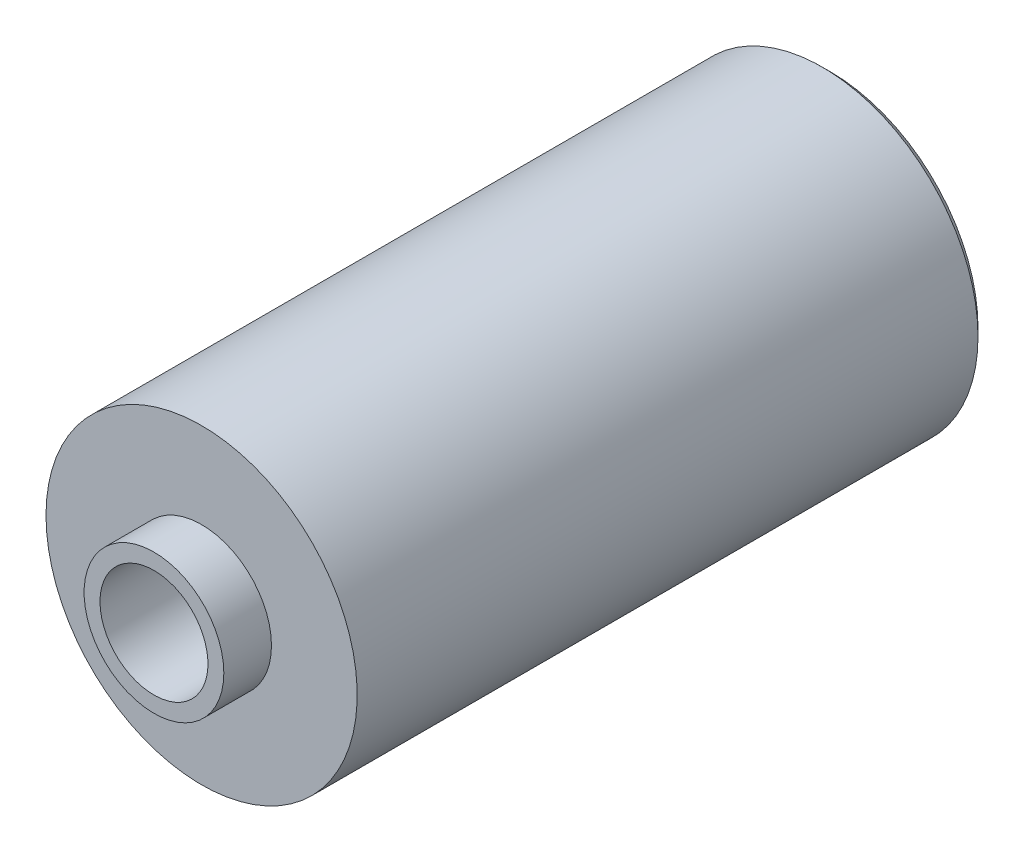
ISO-10303-21;
HEADER;
FILE_DESCRIPTION(('STEP AP214'),'2;1');
FILE_NAME('part.step','',(''),(''),'','','');
FILE_SCHEMA(('AUTOMOTIVE_DESIGN { 1 0 10303 214 1 1 1 1 }'));
ENDSEC;
DATA;
#1=APPLICATION_CONTEXT('core data for automotive mechanical design processes');
#2=APPLICATION_PROTOCOL_DEFINITION('international standard','automotive_design',2000,#1);
#3=PRODUCT_CONTEXT('',#1,'mechanical');
#4=PRODUCT('Part','Part','',(#3));
#5=PRODUCT_RELATED_PRODUCT_CATEGORY('part','',(#4));
#6=PRODUCT_DEFINITION_FORMATION('','',#4);
#7=PRODUCT_DEFINITION_CONTEXT('part definition',#1,'design');
#8=PRODUCT_DEFINITION('design','',#6,#7);
#9=PRODUCT_DEFINITION_SHAPE('','',#8);
#10=(LENGTH_UNIT() NAMED_UNIT(*) SI_UNIT(.MILLI.,.METRE.));
#11=(NAMED_UNIT(*) PLANE_ANGLE_UNIT() SI_UNIT($,.RADIAN.));
#12=(NAMED_UNIT(*) SI_UNIT($,.STERADIAN.) SOLID_ANGLE_UNIT());
#13=UNCERTAINTY_MEASURE_WITH_UNIT(LENGTH_MEASURE(1.E-05),#10,'distance_accuracy_value','');
#14=(GEOMETRIC_REPRESENTATION_CONTEXT(3) GLOBAL_UNCERTAINTY_ASSIGNED_CONTEXT((#13)) GLOBAL_UNIT_ASSIGNED_CONTEXT((#10,
#11,#12)) REPRESENTATION_CONTEXT('',''));
#15=CARTESIAN_POINT('',(0.,0.,0.));
#16=DIRECTION('',(0.,0.,1.));
#17=DIRECTION('',(1.,0.,0.));
#18=AXIS2_PLACEMENT_3D('',#15,#16,#17);
#19=CARTESIAN_POINT('',(0.,0.,19.8));
#20=DIRECTION('',(0.,0.,1.));
#21=DIRECTION('',(1.,0.,0.));
#22=AXIS2_PLACEMENT_3D('',#19,#20,#21);
#23=PLANE('',#22);
#24=CARTESIAN_POINT('',(0.,0.,19.8));
#25=DIRECTION('',(0.,0.,1.));
#26=DIRECTION('',(1.,0.,0.));
#27=AXIS2_PLACEMENT_3D('',#24,#25,#26);
#28=CIRCLE('',#27,4.9);
#29=CARTESIAN_POINT('',(-4.9,0.,19.8));
#30=VERTEX_POINT('',#29);
#31=EDGE_CURVE('E64',#30,#30,#28,.T.);
#32=ORIENTED_EDGE('',*,*,#31,.T.);
#33=EDGE_LOOP('',(#32));
#34=FACE_BOUND('',#33,.T.);
#35=CARTESIAN_POINT('',(0.,0.,19.8));
#36=DIRECTION('',(0.,0.,1.));
#37=DIRECTION('',(1.,0.,0.));
#38=AXIS2_PLACEMENT_3D('',#35,#36,#37);
#39=CIRCLE('',#38,2.2);
#40=CARTESIAN_POINT('',(2.2,0.,19.8));
#41=VERTEX_POINT('',#40);
#42=EDGE_CURVE('E69',#41,#41,#39,.T.);
#43=ORIENTED_EDGE('',*,*,#42,.F.);
#44=EDGE_LOOP('',(#43));
#45=FACE_BOUND('',#44,.T.);
#46=ADVANCED_FACE('F39',(#34,#45),#23,.T.);
#47=CARTESIAN_POINT('',(0.,0.,0.));
#48=DIRECTION('',(0.,0.,1.));
#49=DIRECTION('',(1.,0.,0.));
#50=AXIS2_PLACEMENT_3D('',#47,#48,#49);
#51=PLANE('',#50);
#52=CARTESIAN_POINT('',(0.,0.,0.));
#53=DIRECTION('',(0.,0.,1.));
#54=DIRECTION('',(1.,0.,0.));
#55=AXIS2_PLACEMENT_3D('',#52,#53,#54);
#56=CIRCLE('',#55,1.94999999999999);
#57=CARTESIAN_POINT('',(1.94999999999999,0.,0.));
#58=VERTEX_POINT('',#57);
#59=EDGE_CURVE('E53',#58,#58,#56,.T.);
#60=ORIENTED_EDGE('',*,*,#59,.T.);
#61=EDGE_LOOP('',(#60));
#62=FACE_BOUND('',#61,.T.);
#63=CARTESIAN_POINT('',(0.,0.,0.));
#64=DIRECTION('',(0.,0.,1.));
#65=DIRECTION('',(1.,0.,0.));
#66=AXIS2_PLACEMENT_3D('',#63,#64,#65);
#67=CIRCLE('',#66,4.64999999999999);
#68=CARTESIAN_POINT('',(4.64999999999999,0.,0.));
#69=VERTEX_POINT('',#68);
#70=EDGE_CURVE('E58',#69,#69,#67,.F.);
#71=ORIENTED_EDGE('',*,*,#70,.T.);
#72=EDGE_LOOP('',(#71));
#73=FACE_BOUND('',#72,.T.);
#74=ADVANCED_FACE('F98',(#62,#73),#51,.F.);
#75=CARTESIAN_POINT('',(0.,0.,19.8));
#76=DIRECTION('',(0.,0.,-1.));
#77=DIRECTION('',(-1.,0.,0.));
#78=AXIS2_PLACEMENT_3D('',#75,#76,#77);
#79=CYLINDRICAL_SURFACE('',#78,4.9);
#80=CARTESIAN_POINT('',(0.,0.,0.250000000000018));
#81=DIRECTION('',(0.,0.,1.));
#82=DIRECTION('',(1.,0.,0.));
#83=AXIS2_PLACEMENT_3D('',#80,#81,#82);
#84=CIRCLE('',#83,4.9);
#85=CARTESIAN_POINT('',(-4.9,0.,0.250000000000014));
#86=VERTEX_POINT('',#85);
#87=EDGE_CURVE('E10',#86,#86,#84,.T.);
#88=CARTESIAN_POINT('',(-4.9,0.,0.250000000000014));
#89=CARTESIAN_POINT('',(-4.9,0.,0.453645833333347));
#90=CARTESIAN_POINT('',(-4.9,0.,0.65729166666668));
#91=CARTESIAN_POINT('',(-4.9,0.,1.06458333333335));
#92=CARTESIAN_POINT('',(-4.9,0.,1.26822916666668));
#93=CARTESIAN_POINT('',(-4.9,0.,1.67552083333335));
#94=CARTESIAN_POINT('',(-4.9,0.,1.87916666666668));
#95=CARTESIAN_POINT('',(-4.9,0.,2.28645833333335));
#96=CARTESIAN_POINT('',(-4.9,0.,2.49010416666668));
#97=CARTESIAN_POINT('',(-4.9,0.,2.89739583333335));
#98=CARTESIAN_POINT('',(-4.9,0.,3.10104166666668));
#99=CARTESIAN_POINT('',(-4.9,0.,3.50833333333335));
#100=CARTESIAN_POINT('',(-4.9,0.,3.71197916666668));
#101=CARTESIAN_POINT('',(-4.9,0.,4.11927083333335));
#102=CARTESIAN_POINT('',(-4.9,0.,4.32291666666668));
#103=CARTESIAN_POINT('',(-4.9,0.,4.73020833333334));
#104=CARTESIAN_POINT('',(-4.9,0.,4.93385416666668));
#105=CARTESIAN_POINT('',(-4.9,0.,5.34114583333334));
#106=CARTESIAN_POINT('',(-4.9,0.,5.54479166666668));
#107=CARTESIAN_POINT('',(-4.9,0.,5.95208333333334));
#108=CARTESIAN_POINT('',(-4.9,0.,6.15572916666668));
#109=CARTESIAN_POINT('',(-4.9,0.,6.56302083333334));
#110=CARTESIAN_POINT('',(-4.9,0.,6.76666666666668));
#111=CARTESIAN_POINT('',(-4.9,0.,7.17395833333334));
#112=CARTESIAN_POINT('',(-4.9,0.,7.37760416666668));
#113=CARTESIAN_POINT('',(-4.9,0.,7.78489583333334));
#114=CARTESIAN_POINT('',(-4.9,0.,7.98854166666668));
#115=CARTESIAN_POINT('',(-4.9,0.,8.39583333333334));
#116=CARTESIAN_POINT('',(-4.9,0.,8.59947916666668));
#117=CARTESIAN_POINT('',(-4.9,0.,9.00677083333334));
#118=CARTESIAN_POINT('',(-4.9,0.,9.21041666666667));
#119=CARTESIAN_POINT('',(-4.9,0.,9.61770833333334));
#120=CARTESIAN_POINT('',(-4.9,0.,9.82135416666667));
#121=CARTESIAN_POINT('',(-4.9,0.,10.2286458333333));
#122=CARTESIAN_POINT('',(-4.9,0.,10.4322916666667));
#123=CARTESIAN_POINT('',(-4.9,0.,10.8395833333333));
#124=CARTESIAN_POINT('',(-4.9,0.,11.0432291666667));
#125=CARTESIAN_POINT('',(-4.9,0.,11.4505208333333));
#126=CARTESIAN_POINT('',(-4.9,0.,11.6541666666667));
#127=CARTESIAN_POINT('',(-4.9,0.,12.0614583333333));
#128=CARTESIAN_POINT('',(-4.9,0.,12.2651041666667));
#129=CARTESIAN_POINT('',(-4.9,0.,12.6723958333333));
#130=CARTESIAN_POINT('',(-4.9,0.,12.8760416666667));
#131=CARTESIAN_POINT('',(-4.9,0.,13.2833333333333));
#132=CARTESIAN_POINT('',(-4.9,0.,13.4869791666667));
#133=CARTESIAN_POINT('',(-4.9,0.,13.8942708333333));
#134=CARTESIAN_POINT('',(-4.9,0.,14.0979166666667));
#135=CARTESIAN_POINT('',(-4.9,0.,14.5052083333333));
#136=CARTESIAN_POINT('',(-4.9,0.,14.7088541666667));
#137=CARTESIAN_POINT('',(-4.9,0.,15.1161458333333));
#138=CARTESIAN_POINT('',(-4.9,0.,15.3197916666667));
#139=CARTESIAN_POINT('',(-4.9,0.,15.7270833333333));
#140=CARTESIAN_POINT('',(-4.9,0.,15.9307291666667));
#141=CARTESIAN_POINT('',(-4.9,0.,16.3380208333333));
#142=CARTESIAN_POINT('',(-4.9,0.,16.5416666666667));
#143=CARTESIAN_POINT('',(-4.9,0.,16.9489583333333));
#144=CARTESIAN_POINT('',(-4.9,0.,17.1526041666667));
#145=CARTESIAN_POINT('',(-4.9,0.,17.5598958333333));
#146=CARTESIAN_POINT('',(-4.9,0.,17.7635416666667));
#147=CARTESIAN_POINT('',(-4.9,0.,18.1708333333333));
#148=CARTESIAN_POINT('',(-4.9,0.,18.3744791666667));
#149=CARTESIAN_POINT('',(-4.9,0.,18.7817708333333));
#150=CARTESIAN_POINT('',(-4.9,0.,18.9854166666667));
#151=CARTESIAN_POINT('',(-4.9,0.,19.3927083333333));
#152=CARTESIAN_POINT('',(-4.9,0.,19.5963541666667));
#153=CARTESIAN_POINT('',(-4.9,0.,19.8));
#154=B_SPLINE_CURVE_WITH_KNOTS('',3,(#88,#89,#90,#91,#92,#93,#94,#95,#96,#97,#98,#99,#100,#101,
#102,#103,#104,#105,#106,#107,#108,#109,#110,#111,#112,#113,#114,#115,#116,#117,#118,#119,#120,
#121,#122,#123,#124,#125,#126,#127,#128,#129,#130,#131,#132,#133,#134,#135,#136,#137,#138,#139,
#140,#141,#142,#143,#144,#145,#146,#147,#148,#149,#150,#151,#152,#153),.UNSPECIFIED.,.F.,.F.,(4,
2,2,2,2,2,2,2,2,2,2,2,2,2,2,2,2,2,2,2,2,2,2,2,2,2,2,2,2,2,2,2,4),(0.,0.610937499999999,1.221875,
1.8328125,2.44375,3.0546875,3.665625,4.2765625,4.8875,5.4984375,6.10937499999999,6.7203125,
7.33125,7.94218749999999,8.55312499999999,9.16406249999999,9.77499999999999,10.3859375,
10.996875,11.6078125,12.21875,12.8296875,13.440625,14.0515625,14.6625,15.2734375,15.884375,
16.4953125,17.10625,17.7171875,18.328125,18.9390625,19.55),.UNSPECIFIED.);
#155=EDGE_CURVE('BSEAM95',#86,#30,#154,.T.);
#156=ORIENTED_EDGE('',*,*,#87,.T.);
#157=ORIENTED_EDGE('',*,*,#31,.F.);
#158=ORIENTED_EDGE('',*,*,#155,.T.);
#159=ORIENTED_EDGE('',*,*,#155,.F.);
#160=EDGE_LOOP('',(#156,#158,#157,#159));
#161=FACE_BOUND('',#160,.T.);
#162=ADVANCED_FACE('F95',(#161),#79,.T.);
#163=CARTESIAN_POINT('',(0.,0.,19.8));
#164=DIRECTION('',(0.,0.,-1.));
#165=DIRECTION('',(-1.,0.,0.));
#166=AXIS2_PLACEMENT_3D('',#163,#164,#165);
#167=CYLINDRICAL_SURFACE('',#166,1.7);
#168=CARTESIAN_POINT('',(0.,0.,0.249999999999997));
#169=DIRECTION('',(0.,0.,1.));
#170=DIRECTION('',(1.,0.,0.));
#171=AXIS2_PLACEMENT_3D('',#168,#169,#170);
#172=CIRCLE('',#171,1.7);
#173=CARTESIAN_POINT('',(-1.7,0.,0.249999999999993));
#174=VERTEX_POINT('',#173);
#175=EDGE_CURVE('E48',#174,#174,#172,.F.);
#176=CARTESIAN_POINT('',(0.,0.,21.3));
#177=DIRECTION('',(0.,0.,1.));
#178=DIRECTION('',(1.,0.,0.));
#179=AXIS2_PLACEMENT_3D('',#176,#177,#178);
#180=CIRCLE('',#179,1.7);
#181=CARTESIAN_POINT('',(-1.7,0.,21.3));
#182=VERTEX_POINT('',#181);
#183=EDGE_CURVE('E73',#182,#182,#180,.T.);
#184=CARTESIAN_POINT('',(-1.7,0.,0.249999999999993));
#185=CARTESIAN_POINT('',(-1.7,0.,0.469270833333327));
#186=CARTESIAN_POINT('',(-1.7,0.,0.68854166666666));
#187=CARTESIAN_POINT('',(-1.7,0.,1.12708333333333));
#188=CARTESIAN_POINT('',(-1.7,0.,1.34635416666666));
#189=CARTESIAN_POINT('',(-1.7,0.,1.78489583333333));
#190=CARTESIAN_POINT('',(-1.7,0.,2.00416666666666));
#191=CARTESIAN_POINT('',(-1.7,0.,2.44270833333333));
#192=CARTESIAN_POINT('',(-1.7,0.,2.66197916666666));
#193=CARTESIAN_POINT('',(-1.7,0.,3.10052083333333));
#194=CARTESIAN_POINT('',(-1.7,0.,3.31979166666666));
#195=CARTESIAN_POINT('',(-1.7,0.,3.75833333333333));
#196=CARTESIAN_POINT('',(-1.7,0.,3.97760416666666));
#197=CARTESIAN_POINT('',(-1.7,0.,4.41614583333333));
#198=CARTESIAN_POINT('',(-1.7,0.,4.63541666666666));
#199=CARTESIAN_POINT('',(-1.7,0.,5.07395833333333));
#200=CARTESIAN_POINT('',(-1.7,0.,5.29322916666666));
#201=CARTESIAN_POINT('',(-1.7,0.,5.73177083333333));
#202=CARTESIAN_POINT('',(-1.7,0.,5.95104166666666));
#203=CARTESIAN_POINT('',(-1.7,0.,6.38958333333333));
#204=CARTESIAN_POINT('',(-1.7,0.,6.60885416666666));
#205=CARTESIAN_POINT('',(-1.7,0.,7.04739583333333));
#206=CARTESIAN_POINT('',(-1.7,0.,7.26666666666666));
#207=CARTESIAN_POINT('',(-1.7,0.,7.70520833333333));
#208=CARTESIAN_POINT('',(-1.7,0.,7.92447916666666));
#209=CARTESIAN_POINT('',(-1.7,0.,8.36302083333333));
#210=CARTESIAN_POINT('',(-1.7,0.,8.58229166666666));
#211=CARTESIAN_POINT('',(-1.7,0.,9.02083333333333));
#212=CARTESIAN_POINT('',(-1.7,0.,9.24010416666666));
#213=CARTESIAN_POINT('',(-1.7,0.,9.67864583333333));
#214=CARTESIAN_POINT('',(-1.7,0.,9.89791666666666));
#215=CARTESIAN_POINT('',(-1.7,0.,10.3364583333333));
#216=CARTESIAN_POINT('',(-1.7,0.,10.5557291666667));
#217=CARTESIAN_POINT('',(-1.7,0.,10.9942708333333));
#218=CARTESIAN_POINT('',(-1.7,0.,11.2135416666667));
#219=CARTESIAN_POINT('',(-1.7,0.,11.6520833333333));
#220=CARTESIAN_POINT('',(-1.7,0.,11.8713541666667));
#221=CARTESIAN_POINT('',(-1.7,0.,12.3098958333333));
#222=CARTESIAN_POINT('',(-1.7,0.,12.5291666666667));
#223=CARTESIAN_POINT('',(-1.7,0.,12.9677083333333));
#224=CARTESIAN_POINT('',(-1.7,0.,13.1869791666667));
#225=CARTESIAN_POINT('',(-1.7,0.,13.6255208333333));
#226=CARTESIAN_POINT('',(-1.7,0.,13.8447916666667));
#227=CARTESIAN_POINT('',(-1.7,0.,14.2833333333333));
#228=CARTESIAN_POINT('',(-1.7,0.,14.5026041666667));
#229=CARTESIAN_POINT('',(-1.7,0.,14.9411458333333));
#230=CARTESIAN_POINT('',(-1.7,0.,15.1604166666667));
#231=CARTESIAN_POINT('',(-1.7,0.,15.5989583333333));
#232=CARTESIAN_POINT('',(-1.7,0.,15.8182291666667));
#233=CARTESIAN_POINT('',(-1.7,0.,16.2567708333333));
#234=CARTESIAN_POINT('',(-1.7,0.,16.4760416666667));
#235=CARTESIAN_POINT('',(-1.7,0.,16.9145833333333));
#236=CARTESIAN_POINT('',(-1.7,0.,17.1338541666667));
#237=CARTESIAN_POINT('',(-1.7,0.,17.5723958333333));
#238=CARTESIAN_POINT('',(-1.7,0.,17.7916666666667));
#239=CARTESIAN_POINT('',(-1.7,0.,18.2302083333333));
#240=CARTESIAN_POINT('',(-1.7,0.,18.4494791666667));
#241=CARTESIAN_POINT('',(-1.7,0.,18.8880208333333));
#242=CARTESIAN_POINT('',(-1.7,0.,19.1072916666667));
#243=CARTESIAN_POINT('',(-1.7,0.,19.5458333333333));
#244=CARTESIAN_POINT('',(-1.7,0.,19.7651041666667));
#245=CARTESIAN_POINT('',(-1.7,0.,20.2036458333333));
#246=CARTESIAN_POINT('',(-1.7,0.,20.4229166666667));
#247=CARTESIAN_POINT('',(-1.7,0.,20.8614583333333));
#248=CARTESIAN_POINT('',(-1.7,0.,21.0807291666667));
#249=CARTESIAN_POINT('',(-1.7,0.,21.3));
#250=B_SPLINE_CURVE_WITH_KNOTS('',3,(#184,#185,#186,#187,#188,#189,#190,#191,#192,#193,#194,
#195,#196,#197,#198,#199,#200,#201,#202,#203,#204,#205,#206,#207,#208,#209,#210,#211,#212,#213,
#214,#215,#216,#217,#218,#219,#220,#221,#222,#223,#224,#225,#226,#227,#228,#229,#230,#231,#232,
#233,#234,#235,#236,#237,#238,#239,#240,#241,#242,#243,#244,#245,#246,#247,#248,#249),
.UNSPECIFIED.,.F.,.F.,(4,2,2,2,2,2,2,2,2,2,2,2,2,2,2,2,2,2,2,2,2,2,2,2,2,2,2,2,2,2,2,2,4),(0.,
0.6578125,1.315625,1.9734375,2.63125,3.2890625,3.946875,4.6046875,5.2625,5.9203125,6.578125,
7.2359375,7.89375,8.5515625,9.209375,9.8671875,10.525,11.1828125,11.840625,12.4984375,13.15625,
13.8140625,14.471875,15.1296875,15.7875,16.4453125,17.103125,17.7609375,18.41875,19.0765625,
19.734375,20.3921875,21.05),.UNSPECIFIED.);
#251=EDGE_CURVE('BSEAM81',#174,#182,#250,.T.);
#252=ORIENTED_EDGE('',*,*,#175,.T.);
#253=ORIENTED_EDGE('',*,*,#183,.T.);
#254=ORIENTED_EDGE('',*,*,#251,.T.);
#255=ORIENTED_EDGE('',*,*,#251,.F.);
#256=EDGE_LOOP('',(#252,#254,#253,#255));
#257=FACE_BOUND('',#256,.T.);
#258=ADVANCED_FACE('F81',(#257),#167,.F.);
#259=CARTESIAN_POINT('',(0.,0.,21.3));
#260=DIRECTION('',(0.,0.,1.));
#261=DIRECTION('',(1.,0.,0.));
#262=AXIS2_PLACEMENT_3D('',#259,#260,#261);
#263=PLANE('',#262);
#264=CARTESIAN_POINT('',(0.,0.,21.3));
#265=DIRECTION('',(0.,0.,1.));
#266=DIRECTION('',(1.,0.,0.));
#267=AXIS2_PLACEMENT_3D('',#264,#265,#266);
#268=CIRCLE('',#267,2.2);
#269=CARTESIAN_POINT('',(2.2,0.,21.3));
#270=VERTEX_POINT('',#269);
#271=EDGE_CURVE('E68',#270,#270,#268,.T.);
#272=ORIENTED_EDGE('',*,*,#271,.T.);
#273=EDGE_LOOP('',(#272));
#274=FACE_BOUND('',#273,.T.);
#275=ORIENTED_EDGE('',*,*,#183,.F.);
#276=EDGE_LOOP('',(#275));
#277=FACE_BOUND('',#276,.T.);
#278=ADVANCED_FACE('F83',(#274,#277),#263,.T.);
#279=CARTESIAN_POINT('',(0.,0.,21.3));
#280=DIRECTION('',(0.,0.,-1.));
#281=DIRECTION('',(-1.,0.,0.));
#282=AXIS2_PLACEMENT_3D('',#279,#280,#281);
#283=CYLINDRICAL_SURFACE('',#282,2.2);
#284=ORIENTED_EDGE('',*,*,#271,.F.);
#285=EDGE_LOOP('',(#284));
#286=FACE_BOUND('',#285,.T.);
#287=ORIENTED_EDGE('',*,*,#42,.T.);
#288=EDGE_LOOP('',(#287));
#289=FACE_BOUND('',#288,.T.);
#290=ADVANCED_FACE('F85',(#286,#289),#283,.T.);
#291=CARTESIAN_POINT('',(0.,0.,0.));
#292=DIRECTION('',(0.,0.,-1.));
#293=DIRECTION('',(-1.,0.,0.));
#294=AXIS2_PLACEMENT_3D('',#291,#292,#293);
#295=CONICAL_SURFACE('',#294,1.94999999999999,0.785398163397434);
#296=ORIENTED_EDGE('',*,*,#175,.F.);
#297=EDGE_LOOP('',(#296));
#298=FACE_BOUND('',#297,.T.);
#299=ORIENTED_EDGE('',*,*,#59,.F.);
#300=EDGE_LOOP('',(#299));
#301=FACE_BOUND('',#300,.T.);
#302=ADVANCED_FACE('F92',(#298,#301),#295,.F.);
#303=CARTESIAN_POINT('',(0.,0.,0.250000000000018));
#304=DIRECTION('',(0.,0.,1.));
#305=DIRECTION('',(1.,0.,0.));
#306=AXIS2_PLACEMENT_3D('',#303,#304,#305);
#307=CONICAL_SURFACE('',#306,4.9,0.785398163397447);
#308=ORIENTED_EDGE('',*,*,#70,.F.);
#309=EDGE_LOOP('',(#308));
#310=FACE_BOUND('',#309,.T.);
#311=ORIENTED_EDGE('',*,*,#87,.F.);
#312=EDGE_LOOP('',(#311));
#313=FACE_BOUND('',#312,.T.);
#314=ADVANCED_FACE('F42',(#310,#313),#307,.T.);
#315=CLOSED_SHELL('',(#46,#74,#162,#258,#278,#290,#302,#314));
#316=MANIFOLD_SOLID_BREP('B2',#315);
#317=ADVANCED_BREP_SHAPE_REPRESENTATION('',(#18,#316),#14);
#318=SHAPE_DEFINITION_REPRESENTATION(#9,#317);
ENDSEC;
END-ISO-10303-21;
